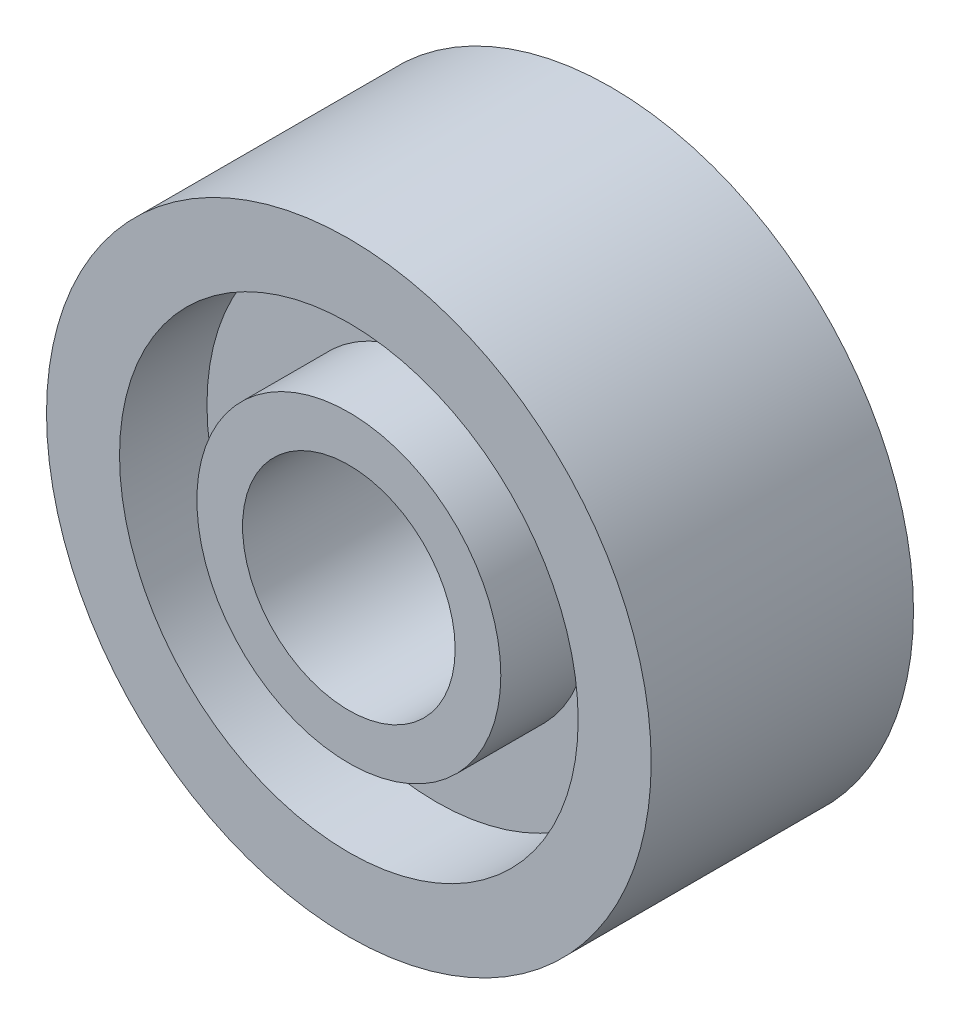
ISO-10303-21;
HEADER;
FILE_DESCRIPTION(('STEP AP214'),'2;1');
FILE_NAME('part.step','',(''),(''),'','','');
FILE_SCHEMA(('AUTOMOTIVE_DESIGN { 1 0 10303 214 1 1 1 1 }'));
ENDSEC;
DATA;
#1=APPLICATION_CONTEXT('core data for automotive mechanical design processes');
#2=APPLICATION_PROTOCOL_DEFINITION('international standard','automotive_design',2000,#1);
#3=PRODUCT_CONTEXT('',#1,'mechanical');
#4=PRODUCT('Part','Part','',(#3));
#5=PRODUCT_RELATED_PRODUCT_CATEGORY('part','',(#4));
#6=PRODUCT_DEFINITION_FORMATION('','',#4);
#7=PRODUCT_DEFINITION_CONTEXT('part definition',#1,'design');
#8=PRODUCT_DEFINITION('design','',#6,#7);
#9=PRODUCT_DEFINITION_SHAPE('','',#8);
#10=(LENGTH_UNIT() NAMED_UNIT(*) SI_UNIT(.MILLI.,.METRE.));
#11=(NAMED_UNIT(*) PLANE_ANGLE_UNIT() SI_UNIT($,.RADIAN.));
#12=(NAMED_UNIT(*) SI_UNIT($,.STERADIAN.) SOLID_ANGLE_UNIT());
#13=UNCERTAINTY_MEASURE_WITH_UNIT(LENGTH_MEASURE(1.E-05),#10,'distance_accuracy_value','');
#14=(GEOMETRIC_REPRESENTATION_CONTEXT(3) GLOBAL_UNCERTAINTY_ASSIGNED_CONTEXT((#13)) GLOBAL_UNIT_ASSIGNED_CONTEXT((#10,
#11,#12)) REPRESENTATION_CONTEXT('',''));
#15=CARTESIAN_POINT('',(0.,0.,0.));
#16=DIRECTION('',(0.,0.,1.));
#17=DIRECTION('',(1.,0.,0.));
#18=AXIS2_PLACEMENT_3D('',#15,#16,#17);
#19=CARTESIAN_POINT('',(0.,7.15,0.));
#20=DIRECTION('',(0.,0.,1.));
#21=DIRECTION('',(1.,0.,0.));
#22=AXIS2_PLACEMENT_3D('',#19,#20,#21);
#23=PLANE('',#22);
#24=CARTESIAN_POINT('',(0.,7.15,0.));
#25=DIRECTION('',(0.,0.,1.));
#26=DIRECTION('',(1.,0.,0.));
#27=AXIS2_PLACEMENT_3D('',#24,#25,#26);
#28=CIRCLE('',#27,3.85);
#29=CARTESIAN_POINT('',(3.85,7.15,0.));
#30=VERTEX_POINT('',#29);
#31=EDGE_CURVE('E28',#30,#30,#28,.T.);
#32=ORIENTED_EDGE('',*,*,#31,.T.);
#33=EDGE_LOOP('',(#32));
#34=FACE_BOUND('',#33,.T.);
#35=CARTESIAN_POINT('',(0.,7.15,0.));
#36=DIRECTION('',(0.,0.,-1.));
#37=DIRECTION('',(-1.,0.,0.));
#38=AXIS2_PLACEMENT_3D('',#35,#36,#37);
#39=CIRCLE('',#38,5.60825459080891);
#40=CARTESIAN_POINT('',(-5.60825459080891,7.15,0.));
#41=VERTEX_POINT('',#40);
#42=EDGE_CURVE('E52',#41,#41,#39,.T.);
#43=ORIENTED_EDGE('',*,*,#42,.T.);
#44=EDGE_LOOP('',(#43));
#45=FACE_BOUND('',#44,.T.);
#46=ADVANCED_FACE('F15',(#34,#45),#23,.F.);
#47=CARTESIAN_POINT('',(0.,7.15,9.5));
#48=DIRECTION('',(0.,0.,1.));
#49=DIRECTION('',(1.,0.,0.));
#50=AXIS2_PLACEMENT_3D('',#47,#48,#49);
#51=PLANE('',#50);
#52=CARTESIAN_POINT('',(0.,7.15,9.5));
#53=DIRECTION('',(0.,0.,1.));
#54=DIRECTION('',(1.,0.,0.));
#55=AXIS2_PLACEMENT_3D('',#52,#53,#54);
#56=CIRCLE('',#55,3.85);
#57=CARTESIAN_POINT('',(3.85,7.15,9.5));
#58=VERTEX_POINT('',#57);
#59=EDGE_CURVE('E26',#58,#58,#56,.T.);
#60=ORIENTED_EDGE('',*,*,#59,.F.);
#61=EDGE_LOOP('',(#60));
#62=FACE_BOUND('',#61,.T.);
#63=CARTESIAN_POINT('',(0.,7.15,9.5));
#64=DIRECTION('',(0.,0.,1.));
#65=DIRECTION('',(1.,0.,0.));
#66=AXIS2_PLACEMENT_3D('',#63,#64,#65);
#67=CIRCLE('',#66,5.50400514822956);
#68=CARTESIAN_POINT('',(5.50400514822956,7.15,9.5));
#69=VERTEX_POINT('',#68);
#70=EDGE_CURVE('E38',#69,#69,#67,.T.);
#71=ORIENTED_EDGE('',*,*,#70,.T.);
#72=EDGE_LOOP('',(#71));
#73=FACE_BOUND('',#72,.T.);
#74=ADVANCED_FACE('F92',(#62,#73),#51,.T.);
#75=CARTESIAN_POINT('',(0.,7.15,9.5));
#76=DIRECTION('',(0.,0.,1.));
#77=DIRECTION('',(1.,0.,0.));
#78=AXIS2_PLACEMENT_3D('',#75,#76,#77);
#79=CIRCLE('',#78,8.30529538847209);
#80=CARTESIAN_POINT('',(8.30529538847209,7.15,9.5));
#81=VERTEX_POINT('',#80);
#82=EDGE_CURVE('E34',#81,#81,#79,.T.);
#83=ORIENTED_EDGE('',*,*,#82,.F.);
#84=EDGE_LOOP('',(#83));
#85=FACE_BOUND('',#84,.T.);
#86=CARTESIAN_POINT('',(0.,7.15,9.5));
#87=DIRECTION('',(0.,0.,1.));
#88=DIRECTION('',(1.,0.,0.));
#89=AXIS2_PLACEMENT_3D('',#86,#87,#88);
#90=CIRCLE('',#89,10.95);
#91=CARTESIAN_POINT('',(10.95,7.15,9.5));
#92=VERTEX_POINT('',#91);
#93=EDGE_CURVE('E10',#92,#92,#90,.T.);
#94=ORIENTED_EDGE('',*,*,#93,.T.);
#95=EDGE_LOOP('',(#94));
#96=FACE_BOUND('',#95,.T.);
#97=ADVANCED_FACE('F77',(#85,#96),#51,.T.);
#98=CARTESIAN_POINT('',(0.,7.15,0.));
#99=DIRECTION('',(0.,0.,-1.));
#100=DIRECTION('',(-1.,0.,0.));
#101=AXIS2_PLACEMENT_3D('',#98,#99,#100);
#102=CIRCLE('',#101,8.42351954754884);
#103=CARTESIAN_POINT('',(-8.42351954754884,7.15,0.));
#104=VERTEX_POINT('',#103);
#105=EDGE_CURVE('E46',#104,#104,#102,.T.);
#106=ORIENTED_EDGE('',*,*,#105,.F.);
#107=EDGE_LOOP('',(#106));
#108=FACE_BOUND('',#107,.T.);
#109=CARTESIAN_POINT('',(0.,7.15,0.));
#110=DIRECTION('',(0.,0.,1.));
#111=DIRECTION('',(1.,0.,0.));
#112=AXIS2_PLACEMENT_3D('',#109,#110,#111);
#113=CIRCLE('',#112,10.95);
#114=CARTESIAN_POINT('',(10.95,7.15,0.));
#115=VERTEX_POINT('',#114);
#116=EDGE_CURVE('E19',#115,#115,#113,.T.);
#117=ORIENTED_EDGE('',*,*,#116,.F.);
#118=EDGE_LOOP('',(#117));
#119=FACE_BOUND('',#118,.T.);
#120=ADVANCED_FACE('F74',(#108,#119),#23,.F.);
#121=CARTESIAN_POINT('',(0.,7.15,9.5));
#122=DIRECTION('',(0.,0.,-1.));
#123=DIRECTION('',(-1.,0.,0.));
#124=AXIS2_PLACEMENT_3D('',#121,#122,#123);
#125=CYLINDRICAL_SURFACE('',#124,10.95);
#126=ORIENTED_EDGE('',*,*,#93,.F.);
#127=EDGE_LOOP('',(#126));
#128=FACE_BOUND('',#127,.T.);
#129=ORIENTED_EDGE('',*,*,#116,.T.);
#130=EDGE_LOOP('',(#129));
#131=FACE_BOUND('',#130,.T.);
#132=ADVANCED_FACE('F17',(#128,#131),#125,.T.);
#133=CARTESIAN_POINT('',(0.,7.15,9.5));
#134=DIRECTION('',(0.,0.,-1.));
#135=DIRECTION('',(-1.,0.,0.));
#136=AXIS2_PLACEMENT_3D('',#133,#134,#135);
#137=CYLINDRICAL_SURFACE('',#136,3.85);
#138=ORIENTED_EDGE('',*,*,#59,.T.);
#139=EDGE_LOOP('',(#138));
#140=FACE_BOUND('',#139,.T.);
#141=ORIENTED_EDGE('',*,*,#31,.F.);
#142=EDGE_LOOP('',(#141));
#143=FACE_BOUND('',#142,.T.);
#144=ADVANCED_FACE('F81',(#140,#143),#137,.F.);
#145=CARTESIAN_POINT('',(0.,7.15,6.33333333333333));
#146=DIRECTION('',(0.,0.,1.));
#147=DIRECTION('',(1.,0.,0.));
#148=AXIS2_PLACEMENT_3D('',#145,#146,#147);
#149=CYLINDRICAL_SURFACE('',#148,5.50400514822956);
#150=CARTESIAN_POINT('',(0.,7.15,6.33333333333333));
#151=DIRECTION('',(0.,0.,1.));
#152=DIRECTION('',(1.,0.,0.));
#153=AXIS2_PLACEMENT_3D('',#150,#151,#152);
#154=CIRCLE('',#153,5.50400514822956);
#155=CARTESIAN_POINT('',(5.50400514822956,7.15,6.33333333333333));
#156=VERTEX_POINT('',#155);
#157=EDGE_CURVE('E37',#156,#156,#154,.T.);
#158=ORIENTED_EDGE('',*,*,#157,.T.);
#159=EDGE_LOOP('',(#158));
#160=FACE_BOUND('',#159,.T.);
#161=ORIENTED_EDGE('',*,*,#70,.F.);
#162=EDGE_LOOP('',(#161));
#163=FACE_BOUND('',#162,.T.);
#164=ADVANCED_FACE('F88',(#160,#163),#149,.T.);
#165=CARTESIAN_POINT('',(0.,7.15,6.33333333333333));
#166=DIRECTION('',(0.,0.,1.));
#167=DIRECTION('',(1.,0.,0.));
#168=AXIS2_PLACEMENT_3D('',#165,#166,#167);
#169=CYLINDRICAL_SURFACE('',#168,8.30529538847209);
#170=CARTESIAN_POINT('',(0.,7.15,6.33333333333333));
#171=DIRECTION('',(0.,0.,1.));
#172=DIRECTION('',(1.,0.,0.));
#173=AXIS2_PLACEMENT_3D('',#170,#171,#172);
#174=CIRCLE('',#173,8.30529538847209);
#175=CARTESIAN_POINT('',(8.30529538847209,7.15,6.33333333333333));
#176=VERTEX_POINT('',#175);
#177=EDGE_CURVE('E31',#176,#176,#174,.T.);
#178=ORIENTED_EDGE('',*,*,#177,.F.);
#179=EDGE_LOOP('',(#178));
#180=FACE_BOUND('',#179,.T.);
#181=ORIENTED_EDGE('',*,*,#82,.T.);
#182=EDGE_LOOP('',(#181));
#183=FACE_BOUND('',#182,.T.);
#184=ADVANCED_FACE('F106',(#180,#183),#169,.F.);
#185=CARTESIAN_POINT('',(0.,0.,6.33333333333333));
#186=DIRECTION('',(0.,0.,1.));
#187=DIRECTION('',(1.,0.,0.));
#188=AXIS2_PLACEMENT_3D('',#185,#186,#187);
#189=PLANE('',#188);
#190=ORIENTED_EDGE('',*,*,#157,.F.);
#191=EDGE_LOOP('',(#190));
#192=FACE_BOUND('',#191,.T.);
#193=ORIENTED_EDGE('',*,*,#177,.T.);
#194=EDGE_LOOP('',(#193));
#195=FACE_BOUND('',#194,.T.);
#196=ADVANCED_FACE('F70',(#192,#195),#189,.T.);
#197=CARTESIAN_POINT('',(0.,7.15,1.));
#198=DIRECTION('',(0.,0.,-1.));
#199=DIRECTION('',(-1.,0.,0.));
#200=AXIS2_PLACEMENT_3D('',#197,#198,#199);
#201=CYLINDRICAL_SURFACE('',#200,8.42351954754884);
#202=CARTESIAN_POINT('',(0.,7.15,1.));
#203=DIRECTION('',(0.,0.,-1.));
#204=DIRECTION('',(-1.,0.,0.));
#205=AXIS2_PLACEMENT_3D('',#202,#203,#204);
#206=CIRCLE('',#205,8.42351954754884);
#207=CARTESIAN_POINT('',(-8.42351954754884,7.15,1.));
#208=VERTEX_POINT('',#207);
#209=EDGE_CURVE('E41',#208,#208,#206,.T.);
#210=ORIENTED_EDGE('',*,*,#209,.F.);
#211=EDGE_LOOP('',(#210));
#212=FACE_BOUND('',#211,.T.);
#213=ORIENTED_EDGE('',*,*,#105,.T.);
#214=EDGE_LOOP('',(#213));
#215=FACE_BOUND('',#214,.T.);
#216=ADVANCED_FACE('F64',(#212,#215),#201,.F.);
#217=CARTESIAN_POINT('',(0.,7.15,1.));
#218=DIRECTION('',(0.,0.,-1.));
#219=DIRECTION('',(-1.,0.,0.));
#220=AXIS2_PLACEMENT_3D('',#217,#218,#219);
#221=PLANE('',#220);
#222=CARTESIAN_POINT('',(0.,7.15,1.));
#223=DIRECTION('',(0.,0.,-1.));
#224=DIRECTION('',(-1.,0.,0.));
#225=AXIS2_PLACEMENT_3D('',#222,#223,#224);
#226=CIRCLE('',#225,5.60825459080891);
#227=CARTESIAN_POINT('',(-5.60825459080891,7.15,1.));
#228=VERTEX_POINT('',#227);
#229=EDGE_CURVE('E49',#228,#228,#226,.T.);
#230=ORIENTED_EDGE('',*,*,#229,.F.);
#231=EDGE_LOOP('',(#230));
#232=FACE_BOUND('',#231,.T.);
#233=ORIENTED_EDGE('',*,*,#209,.T.);
#234=EDGE_LOOP('',(#233));
#235=FACE_BOUND('',#234,.T.);
#236=ADVANCED_FACE('F61',(#232,#235),#221,.T.);
#237=CARTESIAN_POINT('',(0.,7.15,1.));
#238=DIRECTION('',(0.,0.,-1.));
#239=DIRECTION('',(-1.,0.,0.));
#240=AXIS2_PLACEMENT_3D('',#237,#238,#239);
#241=CYLINDRICAL_SURFACE('',#240,5.60825459080891);
#242=ORIENTED_EDGE('',*,*,#229,.T.);
#243=EDGE_LOOP('',(#242));
#244=FACE_BOUND('',#243,.T.);
#245=ORIENTED_EDGE('',*,*,#42,.F.);
#246=EDGE_LOOP('',(#245));
#247=FACE_BOUND('',#246,.T.);
#248=ADVANCED_FACE('F58',(#244,#247),#241,.T.);
#249=CLOSED_SHELL('',(#46,#74,#97,#120,#132,#144,#164,#184,#196,#216,#236,#248));
#250=MANIFOLD_SOLID_BREP('B1',#249);
#251=ADVANCED_BREP_SHAPE_REPRESENTATION('',(#18,#250),#14);
#252=SHAPE_DEFINITION_REPRESENTATION(#9,#251);
ENDSEC;
END-ISO-10303-21;
